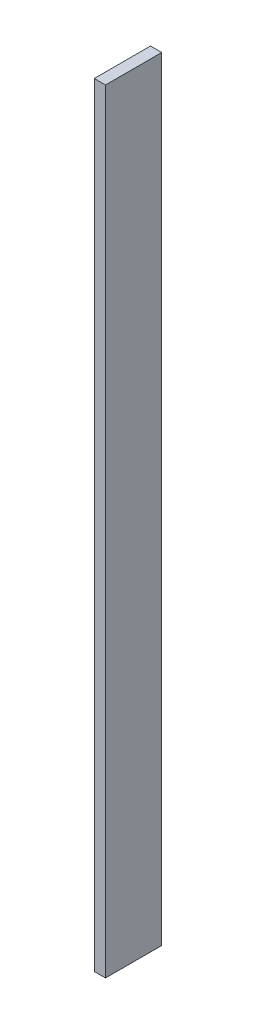
ISO-10303-21;
HEADER;
FILE_DESCRIPTION(('STEP AP214'),'2;1');
FILE_NAME('part.step','',(''),(''),'','','');
FILE_SCHEMA(('AUTOMOTIVE_DESIGN { 1 0 10303 214 1 1 1 1 }'));
ENDSEC;
DATA;
#1=APPLICATION_CONTEXT('core data for automotive mechanical design processes');
#2=APPLICATION_PROTOCOL_DEFINITION('international standard','automotive_design',2000,#1);
#3=PRODUCT_CONTEXT('',#1,'mechanical');
#4=PRODUCT('Part','Part','',(#3));
#5=PRODUCT_RELATED_PRODUCT_CATEGORY('part','',(#4));
#6=PRODUCT_DEFINITION_FORMATION('','',#4);
#7=PRODUCT_DEFINITION_CONTEXT('part definition',#1,'design');
#8=PRODUCT_DEFINITION('design','',#6,#7);
#9=PRODUCT_DEFINITION_SHAPE('','',#8);
#10=(LENGTH_UNIT() NAMED_UNIT(*) SI_UNIT(.MILLI.,.METRE.));
#11=(NAMED_UNIT(*) PLANE_ANGLE_UNIT() SI_UNIT($,.RADIAN.));
#12=(NAMED_UNIT(*) SI_UNIT($,.STERADIAN.) SOLID_ANGLE_UNIT());
#13=UNCERTAINTY_MEASURE_WITH_UNIT(LENGTH_MEASURE(1.E-05),#10,'distance_accuracy_value','');
#14=(GEOMETRIC_REPRESENTATION_CONTEXT(3) GLOBAL_UNCERTAINTY_ASSIGNED_CONTEXT((#13)) GLOBAL_UNIT_ASSIGNED_CONTEXT((#10,
#11,#12)) REPRESENTATION_CONTEXT('',''));
#15=CARTESIAN_POINT('',(0.,0.,0.));
#16=DIRECTION('',(0.,0.,1.));
#17=DIRECTION('',(1.,0.,0.));
#18=AXIS2_PLACEMENT_3D('',#15,#16,#17);
#19=CARTESIAN_POINT('',(0.188536082474265,698.5,25.104006109202));
#20=DIRECTION('',(-1.,0.,0.));
#21=DIRECTION('',(0.,0.,1.));
#22=AXIS2_PLACEMENT_3D('',#19,#20,#21);
#23=PLANE('',#22);
#24=DIRECTION('',(0.,0.,-1.));
#25=VECTOR('',#24,1.);
#26=CARTESIAN_POINT('',(0.188536082474265,0.,25.104006109202));
#27=LINE('',#26,#25);
#28=CARTESIAN_POINT('',(0.188536082474265,0.,25.104006109202));
#29=VERTEX_POINT('',#28);
#30=CARTESIAN_POINT('',(0.188536082474265,0.,-25.695993890798));
#31=VERTEX_POINT('',#30);
#32=EDGE_CURVE('E97',#29,#31,#27,.T.);
#33=ORIENTED_EDGE('',*,*,#32,.T.);
#34=DIRECTION('',(0.,-1.,0.));
#35=VECTOR('',#34,1.);
#36=CARTESIAN_POINT('',(0.188536082474265,698.5,-25.695993890798));
#37=LINE('',#36,#35);
#38=CARTESIAN_POINT('',(0.188536082474265,698.5,-25.695993890798));
#39=VERTEX_POINT('',#38);
#40=EDGE_CURVE('E11',#39,#31,#37,.T.);
#41=ORIENTED_EDGE('',*,*,#40,.F.);
#42=DIRECTION('',(0.,0.,-1.));
#43=VECTOR('',#42,1.);
#44=CARTESIAN_POINT('',(0.188536082474265,698.5,25.104006109202));
#45=LINE('',#44,#43);
#46=CARTESIAN_POINT('',(0.188536082474265,698.5,25.104006109202));
#47=VERTEX_POINT('',#46);
#48=EDGE_CURVE('E85',#47,#39,#45,.T.);
#49=ORIENTED_EDGE('',*,*,#48,.F.);
#50=DIRECTION('',(0.,-1.,0.));
#51=VECTOR('',#50,1.);
#52=CARTESIAN_POINT('',(0.188536082474265,698.5,25.104006109202));
#53=LINE('',#52,#51);
#54=EDGE_CURVE('E93',#47,#29,#53,.T.);
#55=ORIENTED_EDGE('',*,*,#54,.T.);
#56=EDGE_LOOP('',(#33,#41,#49,#55));
#57=FACE_BOUND('',#56,.T.);
#58=ADVANCED_FACE('F34',(#57),#23,.F.);
#59=CARTESIAN_POINT('',(-9.97146391752574,698.5,-25.695993890798));
#60=DIRECTION('',(0.,0.,1.));
#61=DIRECTION('',(1.,0.,0.));
#62=AXIS2_PLACEMENT_3D('',#59,#60,#61);
#63=PLANE('',#62);
#64=DIRECTION('',(-1.,0.,0.));
#65=VECTOR('',#64,1.);
#66=CARTESIAN_POINT('',(-9.97146391752574,0.,-25.695993890798));
#67=LINE('',#66,#65);
#68=CARTESIAN_POINT('',(-9.97146391752574,0.,-25.695993890798));
#69=VERTEX_POINT('',#68);
#70=EDGE_CURVE('E89',#31,#69,#67,.T.);
#71=ORIENTED_EDGE('',*,*,#70,.T.);
#72=DIRECTION('',(0.,-1.,0.));
#73=VECTOR('',#72,1.);
#74=CARTESIAN_POINT('',(-9.97146391752574,698.5,-25.695993890798));
#75=LINE('',#74,#73);
#76=CARTESIAN_POINT('',(-9.97146391752574,698.5,-25.695993890798));
#77=VERTEX_POINT('',#76);
#78=EDGE_CURVE('E42',#77,#69,#75,.T.);
#79=ORIENTED_EDGE('',*,*,#78,.F.);
#80=DIRECTION('',(-1.,0.,0.));
#81=VECTOR('',#80,1.);
#82=CARTESIAN_POINT('',(-9.97146391752574,698.5,-25.695993890798));
#83=LINE('',#82,#81);
#84=EDGE_CURVE('E80',#39,#77,#83,.T.);
#85=ORIENTED_EDGE('',*,*,#84,.F.);
#86=ORIENTED_EDGE('',*,*,#40,.T.);
#87=EDGE_LOOP('',(#71,#79,#85,#86));
#88=FACE_BOUND('',#87,.T.);
#89=ADVANCED_FACE('F88',(#88),#63,.F.);
#90=CARTESIAN_POINT('',(-9.97146391752574,698.5,25.104006109202));
#91=DIRECTION('',(1.,0.,0.));
#92=DIRECTION('',(0.,0.,-1.));
#93=AXIS2_PLACEMENT_3D('',#90,#91,#92);
#94=PLANE('',#93);
#95=DIRECTION('',(0.,0.,1.));
#96=VECTOR('',#95,1.);
#97=CARTESIAN_POINT('',(-9.97146391752574,0.,25.104006109202));
#98=LINE('',#97,#96);
#99=CARTESIAN_POINT('',(-9.97146391752574,0.,25.104006109202));
#100=VERTEX_POINT('',#99);
#101=EDGE_CURVE('E67',#69,#100,#98,.T.);
#102=ORIENTED_EDGE('',*,*,#101,.T.);
#103=DIRECTION('',(0.,-1.,0.));
#104=VECTOR('',#103,1.);
#105=CARTESIAN_POINT('',(-9.97146391752574,698.5,25.104006109202));
#106=LINE('',#105,#104);
#107=CARTESIAN_POINT('',(-9.97146391752574,698.5,25.104006109202));
#108=VERTEX_POINT('',#107);
#109=EDGE_CURVE('E90',#108,#100,#106,.T.);
#110=ORIENTED_EDGE('',*,*,#109,.F.);
#111=DIRECTION('',(0.,0.,1.));
#112=VECTOR('',#111,1.);
#113=CARTESIAN_POINT('',(-9.97146391752574,698.5,25.104006109202));
#114=LINE('',#113,#112);
#115=EDGE_CURVE('E83',#77,#108,#114,.T.);
#116=ORIENTED_EDGE('',*,*,#115,.F.);
#117=ORIENTED_EDGE('',*,*,#78,.T.);
#118=EDGE_LOOP('',(#102,#110,#116,#117));
#119=FACE_BOUND('',#118,.T.);
#120=ADVANCED_FACE('F91',(#119),#94,.F.);
#121=CARTESIAN_POINT('',(-9.97146391752574,698.5,25.104006109202));
#122=DIRECTION('',(0.,0.,-1.));
#123=DIRECTION('',(-1.,0.,0.));
#124=AXIS2_PLACEMENT_3D('',#121,#122,#123);
#125=PLANE('',#124);
#126=DIRECTION('',(1.,0.,0.));
#127=VECTOR('',#126,1.);
#128=CARTESIAN_POINT('',(-9.97146391752574,0.,25.104006109202));
#129=LINE('',#128,#127);
#130=EDGE_CURVE('E73',#100,#29,#129,.T.);
#131=ORIENTED_EDGE('',*,*,#130,.T.);
#132=ORIENTED_EDGE('',*,*,#54,.F.);
#133=DIRECTION('',(1.,0.,0.));
#134=VECTOR('',#133,1.);
#135=CARTESIAN_POINT('',(-9.97146391752574,698.5,25.104006109202));
#136=LINE('',#135,#134);
#137=EDGE_CURVE('E50',#108,#47,#136,.T.);
#138=ORIENTED_EDGE('',*,*,#137,.F.);
#139=ORIENTED_EDGE('',*,*,#109,.T.);
#140=EDGE_LOOP('',(#131,#132,#138,#139));
#141=FACE_BOUND('',#140,.T.);
#142=ADVANCED_FACE('F104',(#141),#125,.F.);
#143=CARTESIAN_POINT('',(0.,698.5,0.));
#144=DIRECTION('',(0.,-1.,0.));
#145=DIRECTION('',(0.,0.,-1.));
#146=AXIS2_PLACEMENT_3D('',#143,#144,#145);
#147=PLANE('',#146);
#148=ORIENTED_EDGE('',*,*,#48,.T.);
#149=ORIENTED_EDGE('',*,*,#84,.T.);
#150=ORIENTED_EDGE('',*,*,#115,.T.);
#151=ORIENTED_EDGE('',*,*,#137,.T.);
#152=EDGE_LOOP('',(#148,#149,#150,#151));
#153=FACE_BOUND('',#152,.T.);
#154=ADVANCED_FACE('F81',(#153),#147,.F.);
#155=CARTESIAN_POINT('',(0.,0.,0.));
#156=DIRECTION('',(0.,-1.,0.));
#157=DIRECTION('',(0.,0.,-1.));
#158=AXIS2_PLACEMENT_3D('',#155,#156,#157);
#159=PLANE('',#158);
#160=ORIENTED_EDGE('',*,*,#32,.F.);
#161=ORIENTED_EDGE('',*,*,#130,.F.);
#162=ORIENTED_EDGE('',*,*,#101,.F.);
#163=ORIENTED_EDGE('',*,*,#70,.F.);
#164=EDGE_LOOP('',(#160,#161,#162,#163));
#165=FACE_BOUND('',#164,.T.);
#166=ADVANCED_FACE('F107',(#165),#159,.T.);
#167=CLOSED_SHELL('',(#58,#89,#120,#142,#154,#166));
#168=MANIFOLD_SOLID_BREP('B2',#167);
#169=ADVANCED_BREP_SHAPE_REPRESENTATION('',(#18,#168),#14);
#170=SHAPE_DEFINITION_REPRESENTATION(#9,#169);
ENDSEC;
END-ISO-10303-21;
